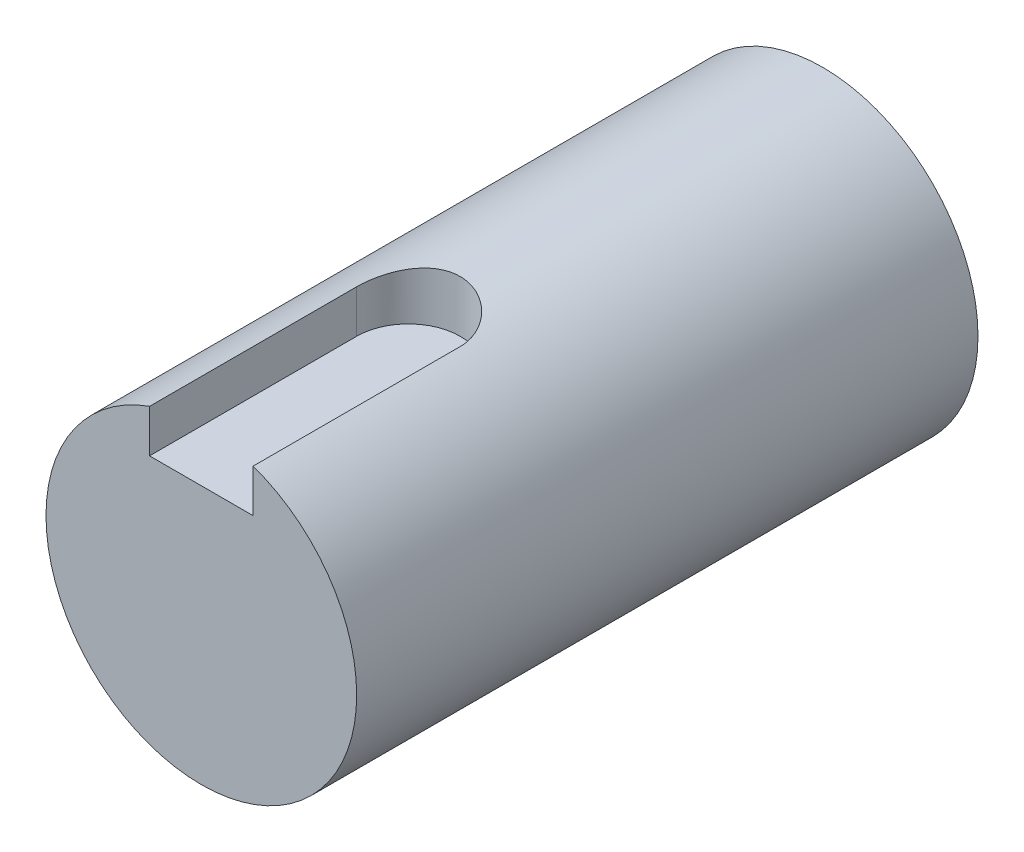
ISO-10303-21;
HEADER;
FILE_DESCRIPTION(('STEP AP214'),'2;1');
FILE_NAME('part.step','',(''),(''),'','','');
FILE_SCHEMA(('AUTOMOTIVE_DESIGN { 1 0 10303 214 1 1 1 1 }'));
ENDSEC;
DATA;
#1=APPLICATION_CONTEXT('core data for automotive mechanical design processes');
#2=APPLICATION_PROTOCOL_DEFINITION('international standard','automotive_design',2000,#1);
#3=PRODUCT_CONTEXT('',#1,'mechanical');
#4=PRODUCT('Part','Part','',(#3));
#5=PRODUCT_RELATED_PRODUCT_CATEGORY('part','',(#4));
#6=PRODUCT_DEFINITION_FORMATION('','',#4);
#7=PRODUCT_DEFINITION_CONTEXT('part definition',#1,'design');
#8=PRODUCT_DEFINITION('design','',#6,#7);
#9=PRODUCT_DEFINITION_SHAPE('','',#8);
#10=(LENGTH_UNIT() NAMED_UNIT(*) SI_UNIT(.MILLI.,.METRE.));
#11=(NAMED_UNIT(*) PLANE_ANGLE_UNIT() SI_UNIT($,.RADIAN.));
#12=(NAMED_UNIT(*) SI_UNIT($,.STERADIAN.) SOLID_ANGLE_UNIT());
#13=UNCERTAINTY_MEASURE_WITH_UNIT(LENGTH_MEASURE(1.E-05),#10,'distance_accuracy_value','');
#14=(GEOMETRIC_REPRESENTATION_CONTEXT(3) GLOBAL_UNCERTAINTY_ASSIGNED_CONTEXT((#13)) GLOBAL_UNIT_ASSIGNED_CONTEXT((#10,
#11,#12)) REPRESENTATION_CONTEXT('',''));
#15=CARTESIAN_POINT('',(0.,0.,0.));
#16=DIRECTION('',(0.,0.,1.));
#17=DIRECTION('',(1.,0.,0.));
#18=AXIS2_PLACEMENT_3D('',#15,#16,#17);
#19=CARTESIAN_POINT('',(0.,0.,30.));
#20=DIRECTION('',(0.,0.,-1.));
#21=DIRECTION('',(-1.,0.,0.));
#22=AXIS2_PLACEMENT_3D('',#19,#20,#21);
#23=CYLINDRICAL_SURFACE('',#22,15.);
#24=DIRECTION('',(0.,0.,-1.));
#25=VECTOR('',#24,1.);
#26=CARTESIAN_POINT('',(-5.,14.142135623731,30.));
#27=LINE('',#26,#25);
#28=CARTESIAN_POINT('',(-5.,14.142135623731,30.));
#29=VERTEX_POINT('',#28);
#30=CARTESIAN_POINT('',(-5.,14.142135623731,10.));
#31=VERTEX_POINT('',#30);
#32=EDGE_CURVE('E104',#29,#31,#27,.T.);
#33=ORIENTED_EDGE('',*,*,#32,.T.);
#34=CARTESIAN_POINT('',(-5.,14.142135623731,10.));
#35=CARTESIAN_POINT('',(-5.00001928272081,14.1421132795953,9.86358817209312));
#36=CARTESIAN_POINT('',(-4.99441839460028,14.144108585197,9.72718501435901));
#37=CARTESIAN_POINT('',(-4.97212026561631,14.1519707752355,9.45543675990578));
#38=CARTESIAN_POINT('',(-4.95542602013328,14.1578366145644,9.3200913875465));
#39=CARTESIAN_POINT('',(-4.91115048442878,14.1732535212275,9.05182134289903));
#40=CARTESIAN_POINT('',(-4.88360148534076,14.182793656248,8.91889070309714));
#41=CARTESIAN_POINT('',(-4.81787909036062,14.2052544389481,8.65597535434243));
#42=CARTESIAN_POINT('',(-4.77970531049258,14.2181752088016,8.52599075204203));
#43=CARTESIAN_POINT('',(-4.69309505128876,14.2469974292543,8.26994100167007));
#44=CARTESIAN_POINT('',(-4.64466686529954,14.2628964699579,8.14387278010676));
#45=CARTESIAN_POINT('',(-4.53792631398361,14.2972152683245,7.8963314520598));
#46=CARTESIAN_POINT('',(-4.47961026060572,14.3156359660384,7.77486008089838));
#47=CARTESIAN_POINT('',(-4.29042487291366,14.3739242294785,7.41843107158721));
#48=CARTESIAN_POINT('',(-4.14528130436108,14.4168308914588,7.19134981636118));
#49=CARTESIAN_POINT('',(-3.81524041281298,14.5077282855086,6.75636212966205));
#50=CARTESIAN_POINT('',(-3.62912046165332,14.5558450324036,6.54941575101716));
#51=CARTESIAN_POINT('',(-3.22494665570402,14.6506912904573,6.16897975946276));
#52=CARTESIAN_POINT('',(-3.00688712664699,14.6974205533429,5.99549610413162));
#53=CARTESIAN_POINT('',(-2.53801699448498,14.7856944680589,5.68259966586795));
#54=CARTESIAN_POINT('',(-2.2865001167083,14.8270719634014,5.54419434373935));
#55=CARTESIAN_POINT('',(-1.76214657981255,14.8984803449503,5.31203947558852));
#56=CARTESIAN_POINT('',(-1.48931646315729,14.9285146967399,5.21827628811271));
#57=CARTESIAN_POINT('',(-0.940146645163366,14.9729535792742,5.08132117918844));
#58=CARTESIAN_POINT('',(-0.664259156539229,14.9878654569488,5.03648357290232));
#59=CARTESIAN_POINT('',(-0.108494863035936,15.0021804126725,4.9934185716859));
#60=CARTESIAN_POINT('',(0.171380975391811,15.0015871861129,4.99518007061241));
#61=CARTESIAN_POINT('',(0.715519207983846,14.9853019394036,5.04422135119862));
#62=CARTESIAN_POINT('',(0.979963426374044,14.9702030725849,5.08971299687324));
#63=CARTESIAN_POINT('',(1.49722040864173,14.9273480020182,5.22196618630538));
#64=CARTESIAN_POINT('',(1.75003252671059,14.8995910964333,5.30873001844996));
#65=CARTESIAN_POINT('',(2.24076278220401,14.8337834991293,5.52210613127959));
#66=CARTESIAN_POINT('',(2.47844127676376,14.7956022127902,5.64922753790655));
#67=CARTESIAN_POINT('',(2.92962419733441,14.7129190630403,5.93930244539046));
#68=CARTESIAN_POINT('',(3.14312202351085,14.6684154814678,6.10226569333055));
#69=CARTESIAN_POINT('',(3.55048180391262,14.5753148518701,6.46834474013009));
#70=CARTESIAN_POINT('',(3.74294939170373,14.5266237190253,6.67298763784732));
#71=CARTESIAN_POINT('',(4.09137879648192,14.4323697370697,7.11224754170862));
#72=CARTESIAN_POINT('',(4.24732881968224,14.3868079019513,7.34687419375444));
#73=CARTESIAN_POINT('',(4.45137197181612,14.3244699574743,7.71839118796905));
#74=CARTESIAN_POINT('',(4.51477947987293,14.3045606178995,7.84656925595869));
#75=CARTESIAN_POINT('',(4.63050119526384,14.2675208843929,8.10820622619605));
#76=CARTESIAN_POINT('',(4.68282002045479,14.2503893343581,8.24166290259467));
#77=CARTESIAN_POINT('',(4.77584283639463,14.2194841629367,8.51277135820791));
#78=CARTESIAN_POINT('',(4.81655946314397,14.2057068907929,8.65041839138002));
#79=CARTESIAN_POINT('',(4.88604801985988,14.1819560641116,8.92896019305926));
#80=CARTESIAN_POINT('',(4.91482540411389,14.1719807728584,9.0698534474523));
#81=CARTESIAN_POINT('',(4.9582745368723,14.1568366544479,9.34205305818844));
#82=CARTESIAN_POINT('',(4.97391718926364,14.1513381564974,9.47318689947325));
#83=CARTESIAN_POINT('',(4.99478118687353,14.143980412972,9.7362104158748));
#84=CARTESIAN_POINT('',(5.00001597952916,14.1421164714419,9.86809889458486));
#85=CARTESIAN_POINT('',(5.,14.142135623731,10.));
#86=B_SPLINE_CURVE_WITH_KNOTS('',3,(#34,#35,#36,#37,#38,#39,#40,#41,#42,#43,#44,#45,#46,#47,#48,
#49,#50,#51,#52,#53,#54,#55,#56,#57,#58,#59,#60,#61,#62,#63,#64,#65,#66,#67,#68,#69,#70,#71,#72,
#73,#74,#75,#76,#77,#78,#79,#80,#81,#82,#83,#84,#85),.UNSPECIFIED.,.F.,.F.,(4,2,2,2,2,2,2,2,2,2,
2,2,2,2,2,2,2,2,2,2,2,2,2,2,2,4),(0.,0.409092423677163,0.818074430847307,1.22584885885815,
1.63363802561078,2.04109864022586,2.44871156823776,3.26359482908313,4.10724851154046,
4.95105225659395,5.81687991006164,6.68244281946294,7.51789679977672,8.35315166493869,
9.15564418669333,9.95818120881897,10.771274204705,11.584588592845,12.4361259663091,
13.2879379758687,13.7206337000479,14.1531488734623,14.5851911765746,15.0170358888757,
15.4131122811713,15.8086765909866),.UNSPECIFIED.);
#87=CARTESIAN_POINT('',(5.,14.1421356237309,10.));
#88=VERTEX_POINT('',#87);
#89=EDGE_CURVE('E11',#31,#88,#86,.T.);
#90=ORIENTED_EDGE('',*,*,#89,.T.);
#91=DIRECTION('',(0.,0.,-1.));
#92=VECTOR('',#91,1.);
#93=CARTESIAN_POINT('',(5.00000000000001,14.1421356237309,30.));
#94=LINE('',#93,#92);
#95=CARTESIAN_POINT('',(5.00000000000001,14.1421356237309,30.));
#96=VERTEX_POINT('',#95);
#97=EDGE_CURVE('E65',#88,#96,#94,.F.);
#98=ORIENTED_EDGE('',*,*,#97,.T.);
#99=CARTESIAN_POINT('',(0.,0.,30.));
#100=DIRECTION('',(0.,0.,1.));
#101=DIRECTION('',(1.,0.,0.));
#102=AXIS2_PLACEMENT_3D('',#99,#100,#101);
#103=CIRCLE('',#102,15.);
#104=EDGE_CURVE('E111',#29,#96,#103,.T.);
#105=ORIENTED_EDGE('',*,*,#104,.F.);
#106=EDGE_LOOP('',(#33,#90,#98,#105));
#107=FACE_BOUND('',#106,.T.);
#108=CARTESIAN_POINT('',(0.,0.,-30.));
#109=DIRECTION('',(0.,0.,1.));
#110=DIRECTION('',(1.,0.,0.));
#111=AXIS2_PLACEMENT_3D('',#108,#109,#110);
#112=CIRCLE('',#111,15.);
#113=CARTESIAN_POINT('',(15.,0.,-30.));
#114=VERTEX_POINT('',#113);
#115=EDGE_CURVE('E110',#114,#114,#112,.T.);
#116=ORIENTED_EDGE('',*,*,#115,.T.);
#117=EDGE_LOOP('',(#116));
#118=FACE_BOUND('',#117,.T.);
#119=ADVANCED_FACE('F37',(#107,#118),#23,.T.);
#120=CARTESIAN_POINT('',(0.,0.,30.));
#121=DIRECTION('',(0.,0.,1.));
#122=DIRECTION('',(1.,0.,0.));
#123=AXIS2_PLACEMENT_3D('',#120,#121,#122);
#124=PLANE('',#123);
#125=DIRECTION('',(0.,1.,0.));
#126=VECTOR('',#125,1.);
#127=CARTESIAN_POINT('',(5.00000000000001,10.,30.));
#128=LINE('',#127,#126);
#129=CARTESIAN_POINT('',(5.00000000000001,10.,30.));
#130=VERTEX_POINT('',#129);
#131=EDGE_CURVE('E105',#130,#96,#128,.T.);
#132=ORIENTED_EDGE('',*,*,#131,.F.);
#133=DIRECTION('',(-1.,0.,0.));
#134=VECTOR('',#133,1.);
#135=CARTESIAN_POINT('',(0.,10.,30.));
#136=LINE('',#135,#134);
#137=CARTESIAN_POINT('',(-5.,10.,30.));
#138=VERTEX_POINT('',#137);
#139=EDGE_CURVE('E50',#130,#138,#136,.T.);
#140=ORIENTED_EDGE('',*,*,#139,.T.);
#141=DIRECTION('',(0.,1.,0.));
#142=VECTOR('',#141,1.);
#143=CARTESIAN_POINT('',(-5.,10.,30.));
#144=LINE('',#143,#142);
#145=EDGE_CURVE('E90',#138,#29,#144,.T.);
#146=ORIENTED_EDGE('',*,*,#145,.T.);
#147=ORIENTED_EDGE('',*,*,#104,.T.);
#148=EDGE_LOOP('',(#132,#140,#146,#147));
#149=FACE_BOUND('',#148,.T.);
#150=ADVANCED_FACE('F117',(#149),#124,.T.);
#151=CARTESIAN_POINT('',(0.,0.,-30.));
#152=DIRECTION('',(0.,0.,1.));
#153=DIRECTION('',(1.,0.,0.));
#154=AXIS2_PLACEMENT_3D('',#151,#152,#153);
#155=PLANE('',#154);
#156=ORIENTED_EDGE('',*,*,#115,.F.);
#157=EDGE_LOOP('',(#156));
#158=FACE_BOUND('',#157,.T.);
#159=ADVANCED_FACE('F125',(#158),#155,.F.);
#160=CARTESIAN_POINT('',(0.,10.,10.));
#161=DIRECTION('',(0.,1.,0.));
#162=DIRECTION('',(0.,0.,1.));
#163=AXIS2_PLACEMENT_3D('',#160,#161,#162);
#164=CYLINDRICAL_SURFACE('',#163,5.);
#165=DIRECTION('',(0.,1.,0.));
#166=VECTOR('',#165,1.);
#167=CARTESIAN_POINT('',(-5.,10.,10.));
#168=LINE('',#167,#166);
#169=CARTESIAN_POINT('',(-5.,10.,10.));
#170=VERTEX_POINT('',#169);
#171=EDGE_CURVE('E84',#170,#31,#168,.T.);
#172=ORIENTED_EDGE('',*,*,#171,.F.);
#173=CARTESIAN_POINT('',(0.,10.,10.));
#174=DIRECTION('',(0.,1.,0.));
#175=DIRECTION('',(0.,0.,1.));
#176=AXIS2_PLACEMENT_3D('',#173,#174,#175);
#177=CIRCLE('',#176,5.);
#178=CARTESIAN_POINT('',(5.,10.,10.));
#179=VERTEX_POINT('',#178);
#180=EDGE_CURVE('E86',#179,#170,#177,.T.);
#181=ORIENTED_EDGE('',*,*,#180,.F.);
#182=DIRECTION('',(0.,1.,0.));
#183=VECTOR('',#182,1.);
#184=CARTESIAN_POINT('',(5.,10.,10.));
#185=LINE('',#184,#183);
#186=EDGE_CURVE('E102',#179,#88,#185,.T.);
#187=ORIENTED_EDGE('',*,*,#186,.T.);
#188=ORIENTED_EDGE('',*,*,#89,.F.);
#189=EDGE_LOOP('',(#172,#181,#187,#188));
#190=FACE_BOUND('',#189,.T.);
#191=ADVANCED_FACE('F85',(#190),#164,.F.);
#192=CARTESIAN_POINT('',(5.,10.,10.));
#193=DIRECTION('',(1.,0.,0.));
#194=DIRECTION('',(0.,0.,-1.));
#195=AXIS2_PLACEMENT_3D('',#192,#193,#194);
#196=PLANE('',#195);
#197=ORIENTED_EDGE('',*,*,#186,.F.);
#198=DIRECTION('',(0.,0.,-1.));
#199=VECTOR('',#198,1.);
#200=CARTESIAN_POINT('',(5.,10.,10.));
#201=LINE('',#200,#199);
#202=EDGE_CURVE('E91',#130,#179,#201,.T.);
#203=ORIENTED_EDGE('',*,*,#202,.F.);
#204=ORIENTED_EDGE('',*,*,#131,.T.);
#205=ORIENTED_EDGE('',*,*,#97,.F.);
#206=EDGE_LOOP('',(#197,#203,#204,#205));
#207=FACE_BOUND('',#206,.T.);
#208=ADVANCED_FACE('F119',(#207),#196,.F.);
#209=CARTESIAN_POINT('',(-5.,10.,10.));
#210=DIRECTION('',(-1.,0.,0.));
#211=DIRECTION('',(0.,0.,1.));
#212=AXIS2_PLACEMENT_3D('',#209,#210,#211);
#213=PLANE('',#212);
#214=ORIENTED_EDGE('',*,*,#145,.F.);
#215=DIRECTION('',(0.,0.,1.));
#216=VECTOR('',#215,1.);
#217=CARTESIAN_POINT('',(-5.,10.,10.));
#218=LINE('',#217,#216);
#219=EDGE_CURVE('E57',#170,#138,#218,.T.);
#220=ORIENTED_EDGE('',*,*,#219,.F.);
#221=ORIENTED_EDGE('',*,*,#171,.T.);
#222=ORIENTED_EDGE('',*,*,#32,.F.);
#223=EDGE_LOOP('',(#214,#220,#221,#222));
#224=FACE_BOUND('',#223,.T.);
#225=ADVANCED_FACE('F93',(#224),#213,.F.);
#226=CARTESIAN_POINT('',(0.,10.,10.));
#227=DIRECTION('',(0.,1.,0.));
#228=DIRECTION('',(0.,0.,1.));
#229=AXIS2_PLACEMENT_3D('',#226,#227,#228);
#230=PLANE('',#229);
#231=ORIENTED_EDGE('',*,*,#202,.T.);
#232=ORIENTED_EDGE('',*,*,#180,.T.);
#233=ORIENTED_EDGE('',*,*,#219,.T.);
#234=ORIENTED_EDGE('',*,*,#139,.F.);
#235=EDGE_LOOP('',(#231,#232,#233,#234));
#236=FACE_BOUND('',#235,.T.);
#237=ADVANCED_FACE('F97',(#236),#230,.T.);
#238=CLOSED_SHELL('',(#119,#150,#159,#191,#208,#225,#237));
#239=MANIFOLD_SOLID_BREP('B2',#238);
#240=ADVANCED_BREP_SHAPE_REPRESENTATION('',(#18,#239),#14);
#241=SHAPE_DEFINITION_REPRESENTATION(#9,#240);
ENDSEC;
END-ISO-10303-21;
